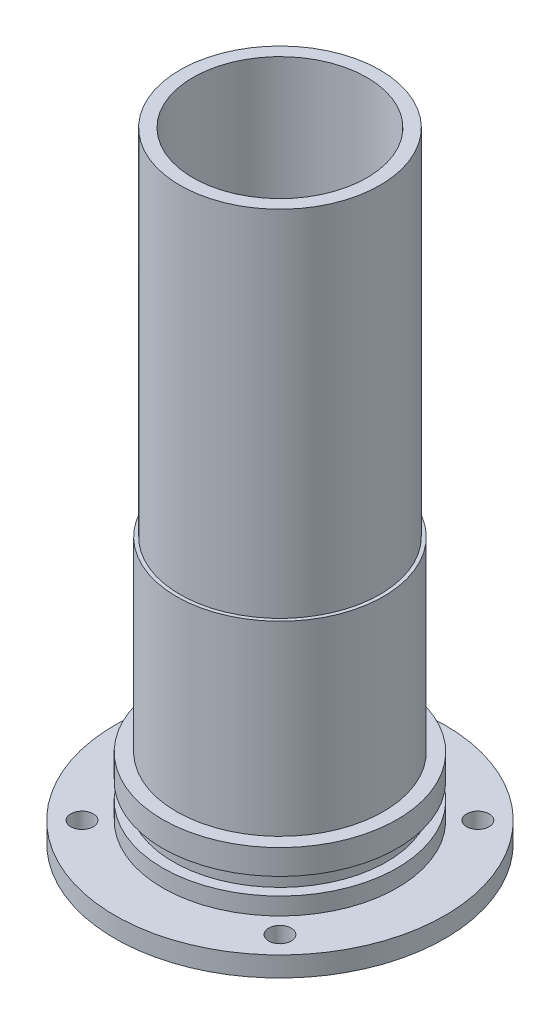
ISO-10303-21;
HEADER;
FILE_DESCRIPTION(('STEP AP214'),'2;1');
FILE_NAME('part.step','',(''),(''),'','','');
FILE_SCHEMA(('AUTOMOTIVE_DESIGN { 1 0 10303 214 1 1 1 1 }'));
ENDSEC;
DATA;
#1=APPLICATION_CONTEXT('core data for automotive mechanical design processes');
#2=APPLICATION_PROTOCOL_DEFINITION('international standard','automotive_design',2000,#1);
#3=PRODUCT_CONTEXT('',#1,'mechanical');
#4=PRODUCT('Part','Part','',(#3));
#5=PRODUCT_RELATED_PRODUCT_CATEGORY('part','',(#4));
#6=PRODUCT_DEFINITION_FORMATION('','',#4);
#7=PRODUCT_DEFINITION_CONTEXT('part definition',#1,'design');
#8=PRODUCT_DEFINITION('design','',#6,#7);
#9=PRODUCT_DEFINITION_SHAPE('','',#8);
#10=(LENGTH_UNIT() NAMED_UNIT(*) SI_UNIT(.MILLI.,.METRE.));
#11=(NAMED_UNIT(*) PLANE_ANGLE_UNIT() SI_UNIT($,.RADIAN.));
#12=(NAMED_UNIT(*) SI_UNIT($,.STERADIAN.) SOLID_ANGLE_UNIT());
#13=UNCERTAINTY_MEASURE_WITH_UNIT(LENGTH_MEASURE(1.E-05),#10,'distance_accuracy_value','');
#14=(GEOMETRIC_REPRESENTATION_CONTEXT(3) GLOBAL_UNCERTAINTY_ASSIGNED_CONTEXT((#13)) GLOBAL_UNIT_ASSIGNED_CONTEXT((#10,
#11,#12)) REPRESENTATION_CONTEXT('',''));
#15=CARTESIAN_POINT('',(0.,0.,0.));
#16=DIRECTION('',(0.,0.,1.));
#17=DIRECTION('',(1.,0.,0.));
#18=AXIS2_PLACEMENT_3D('',#15,#16,#17);
#19=CARTESIAN_POINT('',(33.,0.,0.));
#20=DIRECTION('',(0.,-1.,0.));
#21=DIRECTION('',(0.,0.,-1.));
#22=AXIS2_PLACEMENT_3D('',#19,#20,#21);
#23=PLANE('',#22);
#24=CARTESIAN_POINT('',(-19.7989898732233,0.,-19.7989898732233));
#25=DIRECTION('',(0.,-1.,0.));
#26=DIRECTION('',(0.,0.,-1.));
#27=AXIS2_PLACEMENT_3D('',#24,#25,#26);
#28=CIRCLE('',#27,2.25);
#29=CARTESIAN_POINT('',(-19.7989898732233,0.,-22.0489898732233));
#30=VERTEX_POINT('',#29);
#31=EDGE_CURVE('E90',#30,#30,#28,.T.);
#32=ORIENTED_EDGE('',*,*,#31,.F.);
#33=EDGE_LOOP('',(#32));
#34=FACE_BOUND('',#33,.T.);
#35=CARTESIAN_POINT('',(19.7989898732233,0.,-19.7989898732233));
#36=DIRECTION('',(0.,-1.,0.));
#37=DIRECTION('',(0.,0.,-1.));
#38=AXIS2_PLACEMENT_3D('',#35,#36,#37);
#39=CIRCLE('',#38,2.25);
#40=CARTESIAN_POINT('',(19.7989898732233,0.,-22.0489898732233));
#41=VERTEX_POINT('',#40);
#42=EDGE_CURVE('E96',#41,#41,#39,.T.);
#43=ORIENTED_EDGE('',*,*,#42,.F.);
#44=EDGE_LOOP('',(#43));
#45=FACE_BOUND('',#44,.T.);
#46=CARTESIAN_POINT('',(19.7989898732233,0.,19.7989898732233));
#47=DIRECTION('',(0.,-1.,0.));
#48=DIRECTION('',(0.,0.,-1.));
#49=AXIS2_PLACEMENT_3D('',#46,#47,#48);
#50=CIRCLE('',#49,2.25);
#51=CARTESIAN_POINT('',(19.7989898732233,0.,17.5489898732233));
#52=VERTEX_POINT('',#51);
#53=EDGE_CURVE('E84',#52,#52,#50,.T.);
#54=ORIENTED_EDGE('',*,*,#53,.F.);
#55=EDGE_LOOP('',(#54));
#56=FACE_BOUND('',#55,.T.);
#57=CARTESIAN_POINT('',(-19.7989898732233,0.,19.7989898732233));
#58=DIRECTION('',(0.,-1.,0.));
#59=DIRECTION('',(0.,0.,-1.));
#60=AXIS2_PLACEMENT_3D('',#57,#58,#59);
#61=CIRCLE('',#60,2.25);
#62=CARTESIAN_POINT('',(-19.7989898732233,0.,17.5489898732233));
#63=VERTEX_POINT('',#62);
#64=EDGE_CURVE('E80',#63,#63,#61,.T.);
#65=ORIENTED_EDGE('',*,*,#64,.F.);
#66=EDGE_LOOP('',(#65));
#67=FACE_BOUND('',#66,.T.);
#68=CARTESIAN_POINT('',(0.,0.,0.));
#69=DIRECTION('',(0.,-1.,0.));
#70=DIRECTION('',(0.,0.,-1.));
#71=AXIS2_PLACEMENT_3D('',#68,#69,#70);
#72=CIRCLE('',#71,33.);
#73=CARTESIAN_POINT('',(0.,0.,-33.));
#74=VERTEX_POINT('',#73);
#75=EDGE_CURVE('E77',#74,#74,#72,.T.);
#76=ORIENTED_EDGE('',*,*,#75,.T.);
#77=EDGE_LOOP('',(#76));
#78=FACE_BOUND('',#77,.T.);
#79=CARTESIAN_POINT('',(0.,0.,0.));
#80=DIRECTION('',(0.,-1.,0.));
#81=DIRECTION('',(0.,0.,-1.));
#82=AXIS2_PLACEMENT_3D('',#79,#80,#81);
#83=CIRCLE('',#82,17.4);
#84=CARTESIAN_POINT('',(0.,0.,-17.4));
#85=VERTEX_POINT('',#84);
#86=EDGE_CURVE('E10',#85,#85,#83,.T.);
#87=ORIENTED_EDGE('',*,*,#86,.F.);
#88=EDGE_LOOP('',(#87));
#89=FACE_BOUND('',#88,.T.);
#90=ADVANCED_FACE('F31',(#34,#45,#56,#67,#78,#89),#23,.T.);
#91=CARTESIAN_POINT('',(0.,0.,0.));
#92=DIRECTION('',(0.,-1.,0.));
#93=DIRECTION('',(0.,0.,-1.));
#94=AXIS2_PLACEMENT_3D('',#91,#92,#93);
#95=CYLINDRICAL_SURFACE('',#94,17.4);
#96=ORIENTED_EDGE('',*,*,#86,.T.);
#97=EDGE_LOOP('',(#96));
#98=FACE_BOUND('',#97,.T.);
#99=CARTESIAN_POINT('',(0.,124.,0.));
#100=DIRECTION('',(0.,-1.,0.));
#101=DIRECTION('',(0.,0.,-1.));
#102=AXIS2_PLACEMENT_3D('',#99,#100,#101);
#103=CIRCLE('',#102,17.4);
#104=CARTESIAN_POINT('',(0.,124.,-17.4));
#105=VERTEX_POINT('',#104);
#106=EDGE_CURVE('E37',#105,#105,#103,.T.);
#107=ORIENTED_EDGE('',*,*,#106,.F.);
#108=EDGE_LOOP('',(#107));
#109=FACE_BOUND('',#108,.T.);
#110=ADVANCED_FACE('F109',(#98,#109),#95,.F.);
#111=CARTESIAN_POINT('',(17.4,124.,0.));
#112=DIRECTION('',(0.,1.,0.));
#113=DIRECTION('',(0.,0.,1.));
#114=AXIS2_PLACEMENT_3D('',#111,#112,#113);
#115=PLANE('',#114);
#116=ORIENTED_EDGE('',*,*,#106,.T.);
#117=EDGE_LOOP('',(#116));
#118=FACE_BOUND('',#117,.T.);
#119=CARTESIAN_POINT('',(0.,124.,0.));
#120=DIRECTION('',(0.,-1.,0.));
#121=DIRECTION('',(0.,0.,-1.));
#122=AXIS2_PLACEMENT_3D('',#119,#120,#121);
#123=CIRCLE('',#122,20.);
#124=CARTESIAN_POINT('',(0.,124.,-20.));
#125=VERTEX_POINT('',#124);
#126=EDGE_CURVE('E41',#125,#125,#123,.T.);
#127=ORIENTED_EDGE('',*,*,#126,.F.);
#128=EDGE_LOOP('',(#127));
#129=FACE_BOUND('',#128,.T.);
#130=ADVANCED_FACE('F167',(#118,#129),#115,.T.);
#131=CARTESIAN_POINT('',(0.,0.,0.));
#132=DIRECTION('',(0.,-1.,0.));
#133=DIRECTION('',(0.,0.,-1.));
#134=AXIS2_PLACEMENT_3D('',#131,#132,#133);
#135=CYLINDRICAL_SURFACE('',#134,20.);
#136=ORIENTED_EDGE('',*,*,#126,.T.);
#137=EDGE_LOOP('',(#136));
#138=FACE_BOUND('',#137,.T.);
#139=CARTESIAN_POINT('',(0.,53.1124602600868,0.));
#140=DIRECTION('',(0.,-1.,0.));
#141=DIRECTION('',(0.,0.,-1.));
#142=AXIS2_PLACEMENT_3D('',#139,#140,#141);
#143=CIRCLE('',#142,20.);
#144=CARTESIAN_POINT('',(0.,53.1124602600868,-20.));
#145=VERTEX_POINT('',#144);
#146=EDGE_CURVE('E45',#145,#145,#143,.T.);
#147=ORIENTED_EDGE('',*,*,#146,.F.);
#148=EDGE_LOOP('',(#147));
#149=FACE_BOUND('',#148,.T.);
#150=ADVANCED_FACE('F163',(#138,#149),#135,.T.);
#151=CARTESIAN_POINT('',(20.7,53.1124602600868,0.));
#152=DIRECTION('',(0.,1.,0.));
#153=DIRECTION('',(0.,0.,1.));
#154=AXIS2_PLACEMENT_3D('',#151,#152,#153);
#155=PLANE('',#154);
#156=ORIENTED_EDGE('',*,*,#146,.T.);
#157=EDGE_LOOP('',(#156));
#158=FACE_BOUND('',#157,.T.);
#159=CARTESIAN_POINT('',(0.,53.1124602600868,0.));
#160=DIRECTION('',(0.,-1.,0.));
#161=DIRECTION('',(0.,0.,-1.));
#162=AXIS2_PLACEMENT_3D('',#159,#160,#161);
#163=CIRCLE('',#162,20.7);
#164=CARTESIAN_POINT('',(0.,53.1124602600868,-20.7));
#165=VERTEX_POINT('',#164);
#166=EDGE_CURVE('E50',#165,#165,#163,.T.);
#167=ORIENTED_EDGE('',*,*,#166,.F.);
#168=EDGE_LOOP('',(#167));
#169=FACE_BOUND('',#168,.T.);
#170=ADVANCED_FACE('F159',(#158,#169),#155,.T.);
#171=CARTESIAN_POINT('',(0.,0.,0.));
#172=DIRECTION('',(0.,-1.,0.));
#173=DIRECTION('',(0.,0.,-1.));
#174=AXIS2_PLACEMENT_3D('',#171,#172,#173);
#175=CYLINDRICAL_SURFACE('',#174,20.7);
#176=ORIENTED_EDGE('',*,*,#166,.T.);
#177=EDGE_LOOP('',(#176));
#178=FACE_BOUND('',#177,.T.);
#179=CARTESIAN_POINT('',(0.,15.85,0.));
#180=DIRECTION('',(0.,-1.,0.));
#181=DIRECTION('',(0.,0.,-1.));
#182=AXIS2_PLACEMENT_3D('',#179,#180,#181);
#183=CIRCLE('',#182,20.7);
#184=CARTESIAN_POINT('',(0.,15.85,-20.7));
#185=VERTEX_POINT('',#184);
#186=EDGE_CURVE('E53',#185,#185,#183,.T.);
#187=ORIENTED_EDGE('',*,*,#186,.F.);
#188=EDGE_LOOP('',(#187));
#189=FACE_BOUND('',#188,.T.);
#190=ADVANCED_FACE('F155',(#178,#189),#175,.T.);
#191=CARTESIAN_POINT('',(23.45,15.85,0.));
#192=DIRECTION('',(0.,1.,0.));
#193=DIRECTION('',(0.,0.,1.));
#194=AXIS2_PLACEMENT_3D('',#191,#192,#193);
#195=PLANE('',#194);
#196=ORIENTED_EDGE('',*,*,#186,.T.);
#197=EDGE_LOOP('',(#196));
#198=FACE_BOUND('',#197,.T.);
#199=CARTESIAN_POINT('',(0.,15.85,0.));
#200=DIRECTION('',(0.,-1.,0.));
#201=DIRECTION('',(0.,0.,-1.));
#202=AXIS2_PLACEMENT_3D('',#199,#200,#201);
#203=CIRCLE('',#202,23.45);
#204=CARTESIAN_POINT('',(0.,15.85,-23.45));
#205=VERTEX_POINT('',#204);
#206=EDGE_CURVE('E56',#205,#205,#203,.T.);
#207=ORIENTED_EDGE('',*,*,#206,.F.);
#208=EDGE_LOOP('',(#207));
#209=FACE_BOUND('',#208,.T.);
#210=ADVANCED_FACE('F151',(#198,#209),#195,.T.);
#211=CARTESIAN_POINT('',(0.,0.,0.));
#212=DIRECTION('',(0.,-1.,0.));
#213=DIRECTION('',(0.,0.,-1.));
#214=AXIS2_PLACEMENT_3D('',#211,#212,#213);
#215=CYLINDRICAL_SURFACE('',#214,23.45);
#216=ORIENTED_EDGE('',*,*,#206,.T.);
#217=EDGE_LOOP('',(#216));
#218=FACE_BOUND('',#217,.T.);
#219=CARTESIAN_POINT('',(0.,10.85,0.));
#220=DIRECTION('',(0.,-1.,0.));
#221=DIRECTION('',(0.,0.,-1.));
#222=AXIS2_PLACEMENT_3D('',#219,#220,#221);
#223=CIRCLE('',#222,23.45);
#224=CARTESIAN_POINT('',(0.,10.85,-23.45));
#225=VERTEX_POINT('',#224);
#226=EDGE_CURVE('E59',#225,#225,#223,.T.);
#227=ORIENTED_EDGE('',*,*,#226,.F.);
#228=EDGE_LOOP('',(#227));
#229=FACE_BOUND('',#228,.T.);
#230=ADVANCED_FACE('F147',(#218,#229),#215,.T.);
#231=CARTESIAN_POINT('',(21.3325630800075,10.85,0.));
#232=DIRECTION('',(0.,-1.,0.));
#233=DIRECTION('',(0.,0.,-1.));
#234=AXIS2_PLACEMENT_3D('',#231,#232,#233);
#235=PLANE('',#234);
#236=ORIENTED_EDGE('',*,*,#226,.T.);
#237=EDGE_LOOP('',(#236));
#238=FACE_BOUND('',#237,.T.);
#239=CARTESIAN_POINT('',(0.,10.85,0.));
#240=DIRECTION('',(0.,-1.,0.));
#241=DIRECTION('',(0.,0.,-1.));
#242=AXIS2_PLACEMENT_3D('',#239,#240,#241);
#243=CIRCLE('',#242,21.3325630800075);
#244=CARTESIAN_POINT('',(0.,10.85,-21.3325630800075));
#245=VERTEX_POINT('',#244);
#246=EDGE_CURVE('E62',#245,#245,#243,.T.);
#247=ORIENTED_EDGE('',*,*,#246,.F.);
#248=EDGE_LOOP('',(#247));
#249=FACE_BOUND('',#248,.T.);
#250=ADVANCED_FACE('F143',(#238,#249),#235,.T.);
#251=CARTESIAN_POINT('',(0.,0.,0.));
#252=DIRECTION('',(0.,-1.,0.));
#253=DIRECTION('',(0.,0.,-1.));
#254=AXIS2_PLACEMENT_3D('',#251,#252,#253);
#255=CYLINDRICAL_SURFACE('',#254,21.3325630800075);
#256=ORIENTED_EDGE('',*,*,#246,.T.);
#257=EDGE_LOOP('',(#256));
#258=FACE_BOUND('',#257,.T.);
#259=CARTESIAN_POINT('',(0.,7.45,0.));
#260=DIRECTION('',(0.,-1.,0.));
#261=DIRECTION('',(0.,0.,-1.));
#262=AXIS2_PLACEMENT_3D('',#259,#260,#261);
#263=CIRCLE('',#262,21.3325630800075);
#264=CARTESIAN_POINT('',(0.,7.45,-21.3325630800075));
#265=VERTEX_POINT('',#264);
#266=EDGE_CURVE('E65',#265,#265,#263,.T.);
#267=ORIENTED_EDGE('',*,*,#266,.F.);
#268=EDGE_LOOP('',(#267));
#269=FACE_BOUND('',#268,.T.);
#270=ADVANCED_FACE('F139',(#258,#269),#255,.T.);
#271=CARTESIAN_POINT('',(23.45,7.45,0.));
#272=DIRECTION('',(0.,1.,0.));
#273=DIRECTION('',(0.,0.,1.));
#274=AXIS2_PLACEMENT_3D('',#271,#272,#273);
#275=PLANE('',#274);
#276=ORIENTED_EDGE('',*,*,#266,.T.);
#277=EDGE_LOOP('',(#276));
#278=FACE_BOUND('',#277,.T.);
#279=CARTESIAN_POINT('',(0.,7.45,0.));
#280=DIRECTION('',(0.,-1.,0.));
#281=DIRECTION('',(0.,0.,-1.));
#282=AXIS2_PLACEMENT_3D('',#279,#280,#281);
#283=CIRCLE('',#282,23.45);
#284=CARTESIAN_POINT('',(0.,7.45,-23.45));
#285=VERTEX_POINT('',#284);
#286=EDGE_CURVE('E68',#285,#285,#283,.T.);
#287=ORIENTED_EDGE('',*,*,#286,.F.);
#288=EDGE_LOOP('',(#287));
#289=FACE_BOUND('',#288,.T.);
#290=ADVANCED_FACE('F135',(#278,#289),#275,.T.);
#291=CARTESIAN_POINT('',(0.,0.,0.));
#292=DIRECTION('',(0.,-1.,0.));
#293=DIRECTION('',(0.,0.,-1.));
#294=AXIS2_PLACEMENT_3D('',#291,#292,#293);
#295=CYLINDRICAL_SURFACE('',#294,23.45);
#296=ORIENTED_EDGE('',*,*,#286,.T.);
#297=EDGE_LOOP('',(#296));
#298=FACE_BOUND('',#297,.T.);
#299=CARTESIAN_POINT('',(0.,4.,0.));
#300=DIRECTION('',(0.,-1.,0.));
#301=DIRECTION('',(0.,0.,-1.));
#302=AXIS2_PLACEMENT_3D('',#299,#300,#301);
#303=CIRCLE('',#302,23.45);
#304=CARTESIAN_POINT('',(0.,4.,-23.45));
#305=VERTEX_POINT('',#304);
#306=EDGE_CURVE('E71',#305,#305,#303,.T.);
#307=ORIENTED_EDGE('',*,*,#306,.F.);
#308=EDGE_LOOP('',(#307));
#309=FACE_BOUND('',#308,.T.);
#310=ADVANCED_FACE('F128',(#298,#309),#295,.T.);
#311=CARTESIAN_POINT('',(23.45,4.,0.));
#312=DIRECTION('',(0.,1.,0.));
#313=DIRECTION('',(0.,0.,1.));
#314=AXIS2_PLACEMENT_3D('',#311,#312,#313);
#315=PLANE('',#314);
#316=CARTESIAN_POINT('',(-19.7989898732233,4.,-19.7989898732233));
#317=DIRECTION('',(0.,1.,0.));
#318=DIRECTION('',(0.,0.,1.));
#319=AXIS2_PLACEMENT_3D('',#316,#317,#318);
#320=CIRCLE('',#319,2.25);
#321=CARTESIAN_POINT('',(-19.7989898732233,3.99999999999999,-22.0489898732233));
#322=VERTEX_POINT('',#321);
#323=EDGE_CURVE('E87',#322,#322,#320,.F.);
#324=ORIENTED_EDGE('',*,*,#323,.T.);
#325=EDGE_LOOP('',(#324));
#326=FACE_BOUND('',#325,.T.);
#327=CARTESIAN_POINT('',(19.7989898732233,4.,-19.7989898732233));
#328=DIRECTION('',(0.,1.,0.));
#329=DIRECTION('',(0.,0.,1.));
#330=AXIS2_PLACEMENT_3D('',#327,#328,#329);
#331=CIRCLE('',#330,2.25);
#332=CARTESIAN_POINT('',(19.7989898732233,3.99999999999999,-22.0489898732233));
#333=VERTEX_POINT('',#332);
#334=EDGE_CURVE('E93',#333,#333,#331,.F.);
#335=ORIENTED_EDGE('',*,*,#334,.T.);
#336=EDGE_LOOP('',(#335));
#337=FACE_BOUND('',#336,.T.);
#338=CARTESIAN_POINT('',(19.7989898732233,4.,19.7989898732233));
#339=DIRECTION('',(0.,1.,0.));
#340=DIRECTION('',(0.,0.,1.));
#341=AXIS2_PLACEMENT_3D('',#338,#339,#340);
#342=CIRCLE('',#341,2.25);
#343=CARTESIAN_POINT('',(19.7989898732233,3.99999999999999,17.5489898732233));
#344=VERTEX_POINT('',#343);
#345=EDGE_CURVE('E99',#344,#344,#342,.F.);
#346=ORIENTED_EDGE('',*,*,#345,.T.);
#347=EDGE_LOOP('',(#346));
#348=FACE_BOUND('',#347,.T.);
#349=CARTESIAN_POINT('',(-19.7989898732233,4.,19.7989898732233));
#350=DIRECTION('',(0.,1.,0.));
#351=DIRECTION('',(0.,0.,1.));
#352=AXIS2_PLACEMENT_3D('',#349,#350,#351);
#353=CIRCLE('',#352,2.25);
#354=CARTESIAN_POINT('',(-19.7989898732233,3.99999999999999,17.5489898732233));
#355=VERTEX_POINT('',#354);
#356=EDGE_CURVE('E81',#355,#355,#353,.F.);
#357=ORIENTED_EDGE('',*,*,#356,.T.);
#358=EDGE_LOOP('',(#357));
#359=FACE_BOUND('',#358,.T.);
#360=ORIENTED_EDGE('',*,*,#306,.T.);
#361=EDGE_LOOP('',(#360));
#362=FACE_BOUND('',#361,.T.);
#363=CARTESIAN_POINT('',(0.,4.,0.));
#364=DIRECTION('',(0.,-1.,0.));
#365=DIRECTION('',(0.,0.,-1.));
#366=AXIS2_PLACEMENT_3D('',#363,#364,#365);
#367=CIRCLE('',#366,33.);
#368=CARTESIAN_POINT('',(0.,4.,-33.));
#369=VERTEX_POINT('',#368);
#370=EDGE_CURVE('E74',#369,#369,#367,.T.);
#371=ORIENTED_EDGE('',*,*,#370,.F.);
#372=EDGE_LOOP('',(#371));
#373=FACE_BOUND('',#372,.T.);
#374=ADVANCED_FACE('F119',(#326,#337,#348,#359,#362,#373),#315,.T.);
#375=CARTESIAN_POINT('',(0.,0.,0.));
#376=DIRECTION('',(0.,-1.,0.));
#377=DIRECTION('',(0.,0.,-1.));
#378=AXIS2_PLACEMENT_3D('',#375,#376,#377);
#379=CYLINDRICAL_SURFACE('',#378,33.);
#380=ORIENTED_EDGE('',*,*,#370,.T.);
#381=EDGE_LOOP('',(#380));
#382=FACE_BOUND('',#381,.T.);
#383=ORIENTED_EDGE('',*,*,#75,.F.);
#384=EDGE_LOOP('',(#383));
#385=FACE_BOUND('',#384,.T.);
#386=ADVANCED_FACE('F116',(#382,#385),#379,.T.);
#387=CARTESIAN_POINT('',(-19.7989898732233,124.001,19.7989898732233));
#388=DIRECTION('',(0.,-1.,0.));
#389=DIRECTION('',(0.,0.,-1.));
#390=AXIS2_PLACEMENT_3D('',#387,#388,#389);
#391=CYLINDRICAL_SURFACE('',#390,2.25);
#392=CARTESIAN_POINT('',(-19.7989898732233,3.99999999999999,17.5489898732233));
#393=CARTESIAN_POINT('',(-19.7989898732233,3.95833333333332,17.5489898732233));
#394=CARTESIAN_POINT('',(-19.7989898732233,3.91666666666666,17.5489898732233));
#395=CARTESIAN_POINT('',(-19.7989898732233,3.83333333333332,17.5489898732233));
#396=CARTESIAN_POINT('',(-19.7989898732233,3.79166666666666,17.5489898732233));
#397=CARTESIAN_POINT('',(-19.7989898732233,3.70833333333332,17.5489898732233));
#398=CARTESIAN_POINT('',(-19.7989898732233,3.66666666666666,17.5489898732233));
#399=CARTESIAN_POINT('',(-19.7989898732233,3.58333333333332,17.5489898732233));
#400=CARTESIAN_POINT('',(-19.7989898732233,3.54166666666666,17.5489898732233));
#401=CARTESIAN_POINT('',(-19.7989898732233,3.45833333333332,17.5489898732233));
#402=CARTESIAN_POINT('',(-19.7989898732233,3.41666666666666,17.5489898732233));
#403=CARTESIAN_POINT('',(-19.7989898732233,3.33333333333332,17.5489898732233));
#404=CARTESIAN_POINT('',(-19.7989898732233,3.29166666666666,17.5489898732233));
#405=CARTESIAN_POINT('',(-19.7989898732233,3.20833333333332,17.5489898732233));
#406=CARTESIAN_POINT('',(-19.7989898732233,3.16666666666666,17.5489898732233));
#407=CARTESIAN_POINT('',(-19.7989898732233,3.08333333333332,17.5489898732233));
#408=CARTESIAN_POINT('',(-19.7989898732233,3.04166666666666,17.5489898732233));
#409=CARTESIAN_POINT('',(-19.7989898732233,2.95833333333333,17.5489898732233));
#410=CARTESIAN_POINT('',(-19.7989898732233,2.91666666666666,17.5489898732233));
#411=CARTESIAN_POINT('',(-19.7989898732233,2.83333333333334,17.5489898732233));
#412=CARTESIAN_POINT('',(-19.7989898732233,2.79166666666667,17.5489898732233));
#413=CARTESIAN_POINT('',(-19.7989898732233,2.70833333333334,17.5489898732233));
#414=CARTESIAN_POINT('',(-19.7989898732233,2.66666666666667,17.5489898732233));
#415=CARTESIAN_POINT('',(-19.7989898732233,2.58333333333334,17.5489898732233));
#416=CARTESIAN_POINT('',(-19.7989898732233,2.54166666666667,17.5489898732233));
#417=CARTESIAN_POINT('',(-19.7989898732233,2.45833333333334,17.5489898732233));
#418=CARTESIAN_POINT('',(-19.7989898732233,2.41666666666667,17.5489898732233));
#419=CARTESIAN_POINT('',(-19.7989898732233,2.33333333333334,17.5489898732233));
#420=CARTESIAN_POINT('',(-19.7989898732233,2.29166666666667,17.5489898732233));
#421=CARTESIAN_POINT('',(-19.7989898732233,2.20833333333334,17.5489898732233));
#422=CARTESIAN_POINT('',(-19.7989898732233,2.16666666666667,17.5489898732233));
#423=CARTESIAN_POINT('',(-19.7989898732233,2.08333333333334,17.5489898732233));
#424=CARTESIAN_POINT('',(-19.7989898732233,2.04166666666667,17.5489898732233));
#425=CARTESIAN_POINT('',(-19.7989898732233,1.95833333333334,17.5489898732233));
#426=CARTESIAN_POINT('',(-19.7989898732233,1.91666666666667,17.5489898732233));
#427=CARTESIAN_POINT('',(-19.7989898732233,1.83333333333334,17.5489898732233));
#428=CARTESIAN_POINT('',(-19.7989898732233,1.79166666666667,17.5489898732233));
#429=CARTESIAN_POINT('',(-19.7989898732233,1.70833333333333,17.5489898732233));
#430=CARTESIAN_POINT('',(-19.7989898732233,1.66666666666667,17.5489898732233));
#431=CARTESIAN_POINT('',(-19.7989898732233,1.58333333333333,17.5489898732233));
#432=CARTESIAN_POINT('',(-19.7989898732233,1.54166666666667,17.5489898732233));
#433=CARTESIAN_POINT('',(-19.7989898732233,1.45833333333333,17.5489898732233));
#434=CARTESIAN_POINT('',(-19.7989898732233,1.41666666666667,17.5489898732233));
#435=CARTESIAN_POINT('',(-19.7989898732233,1.33333333333333,17.5489898732233));
#436=CARTESIAN_POINT('',(-19.7989898732233,1.29166666666667,17.5489898732233));
#437=CARTESIAN_POINT('',(-19.7989898732233,1.20833333333333,17.5489898732233));
#438=CARTESIAN_POINT('',(-19.7989898732233,1.16666666666667,17.5489898732233));
#439=CARTESIAN_POINT('',(-19.7989898732233,1.08333333333334,17.5489898732233));
#440=CARTESIAN_POINT('',(-19.7989898732233,1.04166666666668,17.5489898732233));
#441=CARTESIAN_POINT('',(-19.7989898732233,0.958333333333348,17.5489898732233));
#442=CARTESIAN_POINT('',(-19.7989898732233,0.916666666666681,17.5489898732233));
#443=CARTESIAN_POINT('',(-19.7989898732233,0.833333333333348,17.5489898732233));
#444=CARTESIAN_POINT('',(-19.7989898732233,0.791666666666681,17.5489898732233));
#445=CARTESIAN_POINT('',(-19.7989898732233,0.708333333333348,17.5489898732233));
#446=CARTESIAN_POINT('',(-19.7989898732233,0.666666666666681,17.5489898732233));
#447=CARTESIAN_POINT('',(-19.7989898732233,0.583333333333348,17.5489898732233));
#448=CARTESIAN_POINT('',(-19.7989898732233,0.541666666666681,17.5489898732233));
#449=CARTESIAN_POINT('',(-19.7989898732233,0.458333333333348,17.5489898732233));
#450=CARTESIAN_POINT('',(-19.7989898732233,0.416666666666681,17.5489898732233));
#451=CARTESIAN_POINT('',(-19.7989898732233,0.333333333333348,17.5489898732233));
#452=CARTESIAN_POINT('',(-19.7989898732233,0.291666666666681,17.5489898732233));
#453=CARTESIAN_POINT('',(-19.7989898732233,0.208333333333347,17.5489898732233));
#454=CARTESIAN_POINT('',(-19.7989898732233,0.166666666666681,17.5489898732233));
#455=CARTESIAN_POINT('',(-19.7989898732233,0.0833333333333473,17.5489898732233));
#456=CARTESIAN_POINT('',(-19.7989898732233,0.0416666666666805,17.5489898732233));
#457=CARTESIAN_POINT('',(-19.7989898732233,0.,17.5489898732233));
#458=B_SPLINE_CURVE_WITH_KNOTS('',3,(#392,#393,#394,#395,#396,#397,#398,#399,#400,#401,#402,
#403,#404,#405,#406,#407,#408,#409,#410,#411,#412,#413,#414,#415,#416,#417,#418,#419,#420,#421,
#422,#423,#424,#425,#426,#427,#428,#429,#430,#431,#432,#433,#434,#435,#436,#437,#438,#439,#440,
#441,#442,#443,#444,#445,#446,#447,#448,#449,#450,#451,#452,#453,#454,#455,#456,#457),
.UNSPECIFIED.,.F.,.F.,(4,2,2,2,2,2,2,2,2,2,2,2,2,2,2,2,2,2,2,2,2,2,2,2,2,2,2,2,2,2,2,2,4),(0.,
0.125,0.25,0.375,0.5,0.625000000000001,0.750000000000001,0.875000000000001,1.,1.12499999999999,
1.24999999999999,1.37499999999999,1.49999999999999,1.62499999999999,1.74999999999999,
1.87499999999999,1.99999999999999,2.12499999999999,2.24999999999999,2.37499999999999,
2.49999999999999,2.62499999999999,2.74999999999999,2.87499999999999,2.99999999999998,
3.12499999999998,3.24999999999998,3.37499999999998,3.49999999999998,3.62499999999998,
3.74999999999998,3.87499999999998,3.99999999999998),.UNSPECIFIED.);
#459=EDGE_CURVE('BSEAM118',#355,#63,#458,.T.);
#460=ORIENTED_EDGE('',*,*,#356,.F.);
#461=ORIENTED_EDGE('',*,*,#64,.T.);
#462=ORIENTED_EDGE('',*,*,#459,.T.);
#463=ORIENTED_EDGE('',*,*,#459,.F.);
#464=EDGE_LOOP('',(#460,#462,#461,#463));
#465=FACE_BOUND('',#464,.T.);
#466=ADVANCED_FACE('F118',(#465),#391,.F.);
#467=CARTESIAN_POINT('',(19.7989898732233,124.001,19.7989898732233));
#468=DIRECTION('',(0.,-1.,0.));
#469=DIRECTION('',(0.,0.,-1.));
#470=AXIS2_PLACEMENT_3D('',#467,#468,#469);
#471=CYLINDRICAL_SURFACE('',#470,2.25);
#472=CARTESIAN_POINT('',(19.7989898732233,3.99999999999999,17.5489898732233));
#473=CARTESIAN_POINT('',(19.7989898732233,3.95833333333332,17.5489898732233));
#474=CARTESIAN_POINT('',(19.7989898732233,3.91666666666666,17.5489898732233));
#475=CARTESIAN_POINT('',(19.7989898732233,3.83333333333332,17.5489898732233));
#476=CARTESIAN_POINT('',(19.7989898732233,3.79166666666666,17.5489898732233));
#477=CARTESIAN_POINT('',(19.7989898732233,3.70833333333332,17.5489898732233));
#478=CARTESIAN_POINT('',(19.7989898732233,3.66666666666666,17.5489898732233));
#479=CARTESIAN_POINT('',(19.7989898732233,3.58333333333332,17.5489898732233));
#480=CARTESIAN_POINT('',(19.7989898732233,3.54166666666666,17.5489898732233));
#481=CARTESIAN_POINT('',(19.7989898732233,3.45833333333332,17.5489898732233));
#482=CARTESIAN_POINT('',(19.7989898732233,3.41666666666666,17.5489898732233));
#483=CARTESIAN_POINT('',(19.7989898732233,3.33333333333332,17.5489898732233));
#484=CARTESIAN_POINT('',(19.7989898732233,3.29166666666666,17.5489898732233));
#485=CARTESIAN_POINT('',(19.7989898732233,3.20833333333332,17.5489898732233));
#486=CARTESIAN_POINT('',(19.7989898732233,3.16666666666666,17.5489898732233));
#487=CARTESIAN_POINT('',(19.7989898732233,3.08333333333332,17.5489898732233));
#488=CARTESIAN_POINT('',(19.7989898732233,3.04166666666666,17.5489898732233));
#489=CARTESIAN_POINT('',(19.7989898732233,2.95833333333333,17.5489898732233));
#490=CARTESIAN_POINT('',(19.7989898732233,2.91666666666666,17.5489898732233));
#491=CARTESIAN_POINT('',(19.7989898732233,2.83333333333334,17.5489898732233));
#492=CARTESIAN_POINT('',(19.7989898732233,2.79166666666667,17.5489898732233));
#493=CARTESIAN_POINT('',(19.7989898732233,2.70833333333334,17.5489898732233));
#494=CARTESIAN_POINT('',(19.7989898732233,2.66666666666667,17.5489898732233));
#495=CARTESIAN_POINT('',(19.7989898732233,2.58333333333334,17.5489898732233));
#496=CARTESIAN_POINT('',(19.7989898732233,2.54166666666667,17.5489898732233));
#497=CARTESIAN_POINT('',(19.7989898732233,2.45833333333334,17.5489898732233));
#498=CARTESIAN_POINT('',(19.7989898732233,2.41666666666667,17.5489898732233));
#499=CARTESIAN_POINT('',(19.7989898732233,2.33333333333334,17.5489898732233));
#500=CARTESIAN_POINT('',(19.7989898732233,2.29166666666667,17.5489898732233));
#501=CARTESIAN_POINT('',(19.7989898732233,2.20833333333334,17.5489898732233));
#502=CARTESIAN_POINT('',(19.7989898732233,2.16666666666667,17.5489898732233));
#503=CARTESIAN_POINT('',(19.7989898732233,2.08333333333334,17.5489898732233));
#504=CARTESIAN_POINT('',(19.7989898732233,2.04166666666667,17.5489898732233));
#505=CARTESIAN_POINT('',(19.7989898732233,1.95833333333334,17.5489898732233));
#506=CARTESIAN_POINT('',(19.7989898732233,1.91666666666667,17.5489898732233));
#507=CARTESIAN_POINT('',(19.7989898732233,1.83333333333334,17.5489898732233));
#508=CARTESIAN_POINT('',(19.7989898732233,1.79166666666667,17.5489898732233));
#509=CARTESIAN_POINT('',(19.7989898732233,1.70833333333333,17.5489898732233));
#510=CARTESIAN_POINT('',(19.7989898732233,1.66666666666667,17.5489898732233));
#511=CARTESIAN_POINT('',(19.7989898732233,1.58333333333333,17.5489898732233));
#512=CARTESIAN_POINT('',(19.7989898732233,1.54166666666667,17.5489898732233));
#513=CARTESIAN_POINT('',(19.7989898732233,1.45833333333333,17.5489898732233));
#514=CARTESIAN_POINT('',(19.7989898732233,1.41666666666667,17.5489898732233));
#515=CARTESIAN_POINT('',(19.7989898732233,1.33333333333333,17.5489898732233));
#516=CARTESIAN_POINT('',(19.7989898732233,1.29166666666667,17.5489898732233));
#517=CARTESIAN_POINT('',(19.7989898732233,1.20833333333333,17.5489898732233));
#518=CARTESIAN_POINT('',(19.7989898732233,1.16666666666667,17.5489898732233));
#519=CARTESIAN_POINT('',(19.7989898732233,1.08333333333334,17.5489898732233));
#520=CARTESIAN_POINT('',(19.7989898732233,1.04166666666668,17.5489898732233));
#521=CARTESIAN_POINT('',(19.7989898732233,0.958333333333348,17.5489898732233));
#522=CARTESIAN_POINT('',(19.7989898732233,0.916666666666681,17.5489898732233));
#523=CARTESIAN_POINT('',(19.7989898732233,0.833333333333348,17.5489898732233));
#524=CARTESIAN_POINT('',(19.7989898732233,0.791666666666681,17.5489898732233));
#525=CARTESIAN_POINT('',(19.7989898732233,0.708333333333348,17.5489898732233));
#526=CARTESIAN_POINT('',(19.7989898732233,0.666666666666681,17.5489898732233));
#527=CARTESIAN_POINT('',(19.7989898732233,0.583333333333348,17.5489898732233));
#528=CARTESIAN_POINT('',(19.7989898732233,0.541666666666681,17.5489898732233));
#529=CARTESIAN_POINT('',(19.7989898732233,0.458333333333348,17.5489898732233));
#530=CARTESIAN_POINT('',(19.7989898732233,0.416666666666681,17.5489898732233));
#531=CARTESIAN_POINT('',(19.7989898732233,0.333333333333348,17.5489898732233));
#532=CARTESIAN_POINT('',(19.7989898732233,0.291666666666681,17.5489898732233));
#533=CARTESIAN_POINT('',(19.7989898732233,0.208333333333347,17.5489898732233));
#534=CARTESIAN_POINT('',(19.7989898732233,0.166666666666681,17.5489898732233));
#535=CARTESIAN_POINT('',(19.7989898732233,0.0833333333333473,17.5489898732233));
#536=CARTESIAN_POINT('',(19.7989898732233,0.0416666666666805,17.5489898732233));
#537=CARTESIAN_POINT('',(19.7989898732233,0.,17.5489898732233));
#538=B_SPLINE_CURVE_WITH_KNOTS('',3,(#472,#473,#474,#475,#476,#477,#478,#479,#480,#481,#482,
#483,#484,#485,#486,#487,#488,#489,#490,#491,#492,#493,#494,#495,#496,#497,#498,#499,#500,#501,
#502,#503,#504,#505,#506,#507,#508,#509,#510,#511,#512,#513,#514,#515,#516,#517,#518,#519,#520,
#521,#522,#523,#524,#525,#526,#527,#528,#529,#530,#531,#532,#533,#534,#535,#536,#537),
.UNSPECIFIED.,.F.,.F.,(4,2,2,2,2,2,2,2,2,2,2,2,2,2,2,2,2,2,2,2,2,2,2,2,2,2,2,2,2,2,2,2,4),(0.,
0.125,0.25,0.375,0.5,0.625000000000001,0.750000000000001,0.875000000000001,1.,1.12499999999999,
1.24999999999999,1.37499999999999,1.49999999999999,1.62499999999999,1.74999999999999,
1.87499999999999,1.99999999999999,2.12499999999999,2.24999999999999,2.37499999999999,
2.49999999999999,2.62499999999999,2.74999999999999,2.87499999999999,2.99999999999998,
3.12499999999998,3.24999999999998,3.37499999999998,3.49999999999998,3.62499999999998,
3.74999999999998,3.87499999999998,3.99999999999998),.UNSPECIFIED.);
#539=EDGE_CURVE('BSEAM105',#344,#52,#538,.T.);
#540=ORIENTED_EDGE('',*,*,#345,.F.);
#541=ORIENTED_EDGE('',*,*,#53,.T.);
#542=ORIENTED_EDGE('',*,*,#539,.T.);
#543=ORIENTED_EDGE('',*,*,#539,.F.);
#544=EDGE_LOOP('',(#540,#542,#541,#543));
#545=FACE_BOUND('',#544,.T.);
#546=ADVANCED_FACE('F105',(#545),#471,.F.);
#547=CARTESIAN_POINT('',(19.7989898732233,124.001,-19.7989898732233));
#548=DIRECTION('',(0.,-1.,0.));
#549=DIRECTION('',(0.,0.,-1.));
#550=AXIS2_PLACEMENT_3D('',#547,#548,#549);
#551=CYLINDRICAL_SURFACE('',#550,2.25);
#552=CARTESIAN_POINT('',(19.7989898732233,3.99999999999999,-22.0489898732233));
#553=CARTESIAN_POINT('',(19.7989898732233,3.95833333333332,-22.0489898732233));
#554=CARTESIAN_POINT('',(19.7989898732233,3.91666666666666,-22.0489898732233));
#555=CARTESIAN_POINT('',(19.7989898732233,3.83333333333332,-22.0489898732233));
#556=CARTESIAN_POINT('',(19.7989898732233,3.79166666666666,-22.0489898732233));
#557=CARTESIAN_POINT('',(19.7989898732233,3.70833333333332,-22.0489898732233));
#558=CARTESIAN_POINT('',(19.7989898732233,3.66666666666666,-22.0489898732233));
#559=CARTESIAN_POINT('',(19.7989898732233,3.58333333333332,-22.0489898732233));
#560=CARTESIAN_POINT('',(19.7989898732233,3.54166666666666,-22.0489898732233));
#561=CARTESIAN_POINT('',(19.7989898732233,3.45833333333332,-22.0489898732233));
#562=CARTESIAN_POINT('',(19.7989898732233,3.41666666666666,-22.0489898732233));
#563=CARTESIAN_POINT('',(19.7989898732233,3.33333333333332,-22.0489898732233));
#564=CARTESIAN_POINT('',(19.7989898732233,3.29166666666666,-22.0489898732233));
#565=CARTESIAN_POINT('',(19.7989898732233,3.20833333333332,-22.0489898732233));
#566=CARTESIAN_POINT('',(19.7989898732233,3.16666666666666,-22.0489898732233));
#567=CARTESIAN_POINT('',(19.7989898732233,3.08333333333332,-22.0489898732233));
#568=CARTESIAN_POINT('',(19.7989898732233,3.04166666666666,-22.0489898732233));
#569=CARTESIAN_POINT('',(19.7989898732233,2.95833333333333,-22.0489898732233));
#570=CARTESIAN_POINT('',(19.7989898732233,2.91666666666666,-22.0489898732233));
#571=CARTESIAN_POINT('',(19.7989898732233,2.83333333333334,-22.0489898732233));
#572=CARTESIAN_POINT('',(19.7989898732233,2.79166666666667,-22.0489898732233));
#573=CARTESIAN_POINT('',(19.7989898732233,2.70833333333334,-22.0489898732233));
#574=CARTESIAN_POINT('',(19.7989898732233,2.66666666666667,-22.0489898732233));
#575=CARTESIAN_POINT('',(19.7989898732233,2.58333333333334,-22.0489898732233));
#576=CARTESIAN_POINT('',(19.7989898732233,2.54166666666667,-22.0489898732233));
#577=CARTESIAN_POINT('',(19.7989898732233,2.45833333333334,-22.0489898732233));
#578=CARTESIAN_POINT('',(19.7989898732233,2.41666666666667,-22.0489898732233));
#579=CARTESIAN_POINT('',(19.7989898732233,2.33333333333334,-22.0489898732233));
#580=CARTESIAN_POINT('',(19.7989898732233,2.29166666666667,-22.0489898732233));
#581=CARTESIAN_POINT('',(19.7989898732233,2.20833333333334,-22.0489898732233));
#582=CARTESIAN_POINT('',(19.7989898732233,2.16666666666667,-22.0489898732233));
#583=CARTESIAN_POINT('',(19.7989898732233,2.08333333333334,-22.0489898732233));
#584=CARTESIAN_POINT('',(19.7989898732233,2.04166666666667,-22.0489898732233));
#585=CARTESIAN_POINT('',(19.7989898732233,1.95833333333334,-22.0489898732233));
#586=CARTESIAN_POINT('',(19.7989898732233,1.91666666666667,-22.0489898732233));
#587=CARTESIAN_POINT('',(19.7989898732233,1.83333333333334,-22.0489898732233));
#588=CARTESIAN_POINT('',(19.7989898732233,1.79166666666667,-22.0489898732233));
#589=CARTESIAN_POINT('',(19.7989898732233,1.70833333333333,-22.0489898732233));
#590=CARTESIAN_POINT('',(19.7989898732233,1.66666666666667,-22.0489898732233));
#591=CARTESIAN_POINT('',(19.7989898732233,1.58333333333333,-22.0489898732233));
#592=CARTESIAN_POINT('',(19.7989898732233,1.54166666666667,-22.0489898732233));
#593=CARTESIAN_POINT('',(19.7989898732233,1.45833333333333,-22.0489898732233));
#594=CARTESIAN_POINT('',(19.7989898732233,1.41666666666667,-22.0489898732233));
#595=CARTESIAN_POINT('',(19.7989898732233,1.33333333333333,-22.0489898732233));
#596=CARTESIAN_POINT('',(19.7989898732233,1.29166666666667,-22.0489898732233));
#597=CARTESIAN_POINT('',(19.7989898732233,1.20833333333333,-22.0489898732233));
#598=CARTESIAN_POINT('',(19.7989898732233,1.16666666666667,-22.0489898732233));
#599=CARTESIAN_POINT('',(19.7989898732233,1.08333333333334,-22.0489898732233));
#600=CARTESIAN_POINT('',(19.7989898732233,1.04166666666668,-22.0489898732233));
#601=CARTESIAN_POINT('',(19.7989898732233,0.958333333333348,-22.0489898732233));
#602=CARTESIAN_POINT('',(19.7989898732233,0.916666666666681,-22.0489898732233));
#603=CARTESIAN_POINT('',(19.7989898732233,0.833333333333348,-22.0489898732233));
#604=CARTESIAN_POINT('',(19.7989898732233,0.791666666666681,-22.0489898732233));
#605=CARTESIAN_POINT('',(19.7989898732233,0.708333333333348,-22.0489898732233));
#606=CARTESIAN_POINT('',(19.7989898732233,0.666666666666681,-22.0489898732233));
#607=CARTESIAN_POINT('',(19.7989898732233,0.583333333333348,-22.0489898732233));
#608=CARTESIAN_POINT('',(19.7989898732233,0.541666666666681,-22.0489898732233));
#609=CARTESIAN_POINT('',(19.7989898732233,0.458333333333348,-22.0489898732233));
#610=CARTESIAN_POINT('',(19.7989898732233,0.416666666666681,-22.0489898732233));
#611=CARTESIAN_POINT('',(19.7989898732233,0.333333333333348,-22.0489898732233));
#612=CARTESIAN_POINT('',(19.7989898732233,0.291666666666681,-22.0489898732233));
#613=CARTESIAN_POINT('',(19.7989898732233,0.208333333333347,-22.0489898732233));
#614=CARTESIAN_POINT('',(19.7989898732233,0.166666666666681,-22.0489898732233));
#615=CARTESIAN_POINT('',(19.7989898732233,0.0833333333333473,-22.0489898732233));
#616=CARTESIAN_POINT('',(19.7989898732233,0.0416666666666805,-22.0489898732233));
#617=CARTESIAN_POINT('',(19.7989898732233,0.,-22.0489898732233));
#618=B_SPLINE_CURVE_WITH_KNOTS('',3,(#552,#553,#554,#555,#556,#557,#558,#559,#560,#561,#562,
#563,#564,#565,#566,#567,#568,#569,#570,#571,#572,#573,#574,#575,#576,#577,#578,#579,#580,#581,
#582,#583,#584,#585,#586,#587,#588,#589,#590,#591,#592,#593,#594,#595,#596,#597,#598,#599,#600,
#601,#602,#603,#604,#605,#606,#607,#608,#609,#610,#611,#612,#613,#614,#615,#616,#617),
.UNSPECIFIED.,.F.,.F.,(4,2,2,2,2,2,2,2,2,2,2,2,2,2,2,2,2,2,2,2,2,2,2,2,2,2,2,2,2,2,2,2,4),(0.,
0.125,0.25,0.375,0.5,0.625000000000001,0.750000000000001,0.875000000000001,1.,1.12499999999999,
1.24999999999999,1.37499999999999,1.49999999999999,1.62499999999999,1.74999999999999,
1.87499999999999,1.99999999999999,2.12499999999999,2.24999999999999,2.37499999999999,
2.49999999999999,2.62499999999999,2.74999999999999,2.87499999999999,2.99999999999998,
3.12499999999998,3.24999999999998,3.37499999999998,3.49999999999998,3.62499999999998,
3.74999999999998,3.87499999999998,3.99999999999998),.UNSPECIFIED.);
#619=EDGE_CURVE('BSEAM238',#333,#41,#618,.T.);
#620=ORIENTED_EDGE('',*,*,#334,.F.);
#621=ORIENTED_EDGE('',*,*,#42,.T.);
#622=ORIENTED_EDGE('',*,*,#619,.T.);
#623=ORIENTED_EDGE('',*,*,#619,.F.);
#624=EDGE_LOOP('',(#620,#622,#621,#623));
#625=FACE_BOUND('',#624,.T.);
#626=ADVANCED_FACE('F238',(#625),#551,.F.);
#627=CARTESIAN_POINT('',(-19.7989898732233,124.001,-19.7989898732233));
#628=DIRECTION('',(0.,-1.,0.));
#629=DIRECTION('',(0.,0.,-1.));
#630=AXIS2_PLACEMENT_3D('',#627,#628,#629);
#631=CYLINDRICAL_SURFACE('',#630,2.25);
#632=CARTESIAN_POINT('',(-19.7989898732233,3.99999999999999,-22.0489898732233));
#633=CARTESIAN_POINT('',(-19.7989898732233,3.95833333333332,-22.0489898732233));
#634=CARTESIAN_POINT('',(-19.7989898732233,3.91666666666666,-22.0489898732233));
#635=CARTESIAN_POINT('',(-19.7989898732233,3.83333333333332,-22.0489898732233));
#636=CARTESIAN_POINT('',(-19.7989898732233,3.79166666666666,-22.0489898732233));
#637=CARTESIAN_POINT('',(-19.7989898732233,3.70833333333332,-22.0489898732233));
#638=CARTESIAN_POINT('',(-19.7989898732233,3.66666666666666,-22.0489898732233));
#639=CARTESIAN_POINT('',(-19.7989898732233,3.58333333333332,-22.0489898732233));
#640=CARTESIAN_POINT('',(-19.7989898732233,3.54166666666666,-22.0489898732233));
#641=CARTESIAN_POINT('',(-19.7989898732233,3.45833333333332,-22.0489898732233));
#642=CARTESIAN_POINT('',(-19.7989898732233,3.41666666666666,-22.0489898732233));
#643=CARTESIAN_POINT('',(-19.7989898732233,3.33333333333332,-22.0489898732233));
#644=CARTESIAN_POINT('',(-19.7989898732233,3.29166666666666,-22.0489898732233));
#645=CARTESIAN_POINT('',(-19.7989898732233,3.20833333333332,-22.0489898732233));
#646=CARTESIAN_POINT('',(-19.7989898732233,3.16666666666666,-22.0489898732233));
#647=CARTESIAN_POINT('',(-19.7989898732233,3.08333333333332,-22.0489898732233));
#648=CARTESIAN_POINT('',(-19.7989898732233,3.04166666666666,-22.0489898732233));
#649=CARTESIAN_POINT('',(-19.7989898732233,2.95833333333333,-22.0489898732233));
#650=CARTESIAN_POINT('',(-19.7989898732233,2.91666666666666,-22.0489898732233));
#651=CARTESIAN_POINT('',(-19.7989898732233,2.83333333333334,-22.0489898732233));
#652=CARTESIAN_POINT('',(-19.7989898732233,2.79166666666667,-22.0489898732233));
#653=CARTESIAN_POINT('',(-19.7989898732233,2.70833333333334,-22.0489898732233));
#654=CARTESIAN_POINT('',(-19.7989898732233,2.66666666666667,-22.0489898732233));
#655=CARTESIAN_POINT('',(-19.7989898732233,2.58333333333334,-22.0489898732233));
#656=CARTESIAN_POINT('',(-19.7989898732233,2.54166666666667,-22.0489898732233));
#657=CARTESIAN_POINT('',(-19.7989898732233,2.45833333333334,-22.0489898732233));
#658=CARTESIAN_POINT('',(-19.7989898732233,2.41666666666667,-22.0489898732233));
#659=CARTESIAN_POINT('',(-19.7989898732233,2.33333333333334,-22.0489898732233));
#660=CARTESIAN_POINT('',(-19.7989898732233,2.29166666666667,-22.0489898732233));
#661=CARTESIAN_POINT('',(-19.7989898732233,2.20833333333334,-22.0489898732233));
#662=CARTESIAN_POINT('',(-19.7989898732233,2.16666666666667,-22.0489898732233));
#663=CARTESIAN_POINT('',(-19.7989898732233,2.08333333333334,-22.0489898732233));
#664=CARTESIAN_POINT('',(-19.7989898732233,2.04166666666667,-22.0489898732233));
#665=CARTESIAN_POINT('',(-19.7989898732233,1.95833333333334,-22.0489898732233));
#666=CARTESIAN_POINT('',(-19.7989898732233,1.91666666666667,-22.0489898732233));
#667=CARTESIAN_POINT('',(-19.7989898732233,1.83333333333334,-22.0489898732233));
#668=CARTESIAN_POINT('',(-19.7989898732233,1.79166666666667,-22.0489898732233));
#669=CARTESIAN_POINT('',(-19.7989898732233,1.70833333333333,-22.0489898732233));
#670=CARTESIAN_POINT('',(-19.7989898732233,1.66666666666667,-22.0489898732233));
#671=CARTESIAN_POINT('',(-19.7989898732233,1.58333333333333,-22.0489898732233));
#672=CARTESIAN_POINT('',(-19.7989898732233,1.54166666666667,-22.0489898732233));
#673=CARTESIAN_POINT('',(-19.7989898732233,1.45833333333333,-22.0489898732233));
#674=CARTESIAN_POINT('',(-19.7989898732233,1.41666666666667,-22.0489898732233));
#675=CARTESIAN_POINT('',(-19.7989898732233,1.33333333333333,-22.0489898732233));
#676=CARTESIAN_POINT('',(-19.7989898732233,1.29166666666667,-22.0489898732233));
#677=CARTESIAN_POINT('',(-19.7989898732233,1.20833333333333,-22.0489898732233));
#678=CARTESIAN_POINT('',(-19.7989898732233,1.16666666666667,-22.0489898732233));
#679=CARTESIAN_POINT('',(-19.7989898732233,1.08333333333334,-22.0489898732233));
#680=CARTESIAN_POINT('',(-19.7989898732233,1.04166666666668,-22.0489898732233));
#681=CARTESIAN_POINT('',(-19.7989898732233,0.958333333333348,-22.0489898732233));
#682=CARTESIAN_POINT('',(-19.7989898732233,0.916666666666681,-22.0489898732233));
#683=CARTESIAN_POINT('',(-19.7989898732233,0.833333333333348,-22.0489898732233));
#684=CARTESIAN_POINT('',(-19.7989898732233,0.791666666666681,-22.0489898732233));
#685=CARTESIAN_POINT('',(-19.7989898732233,0.708333333333348,-22.0489898732233));
#686=CARTESIAN_POINT('',(-19.7989898732233,0.666666666666681,-22.0489898732233));
#687=CARTESIAN_POINT('',(-19.7989898732233,0.583333333333348,-22.0489898732233));
#688=CARTESIAN_POINT('',(-19.7989898732233,0.541666666666681,-22.0489898732233));
#689=CARTESIAN_POINT('',(-19.7989898732233,0.458333333333348,-22.0489898732233));
#690=CARTESIAN_POINT('',(-19.7989898732233,0.416666666666681,-22.0489898732233));
#691=CARTESIAN_POINT('',(-19.7989898732233,0.333333333333348,-22.0489898732233));
#692=CARTESIAN_POINT('',(-19.7989898732233,0.291666666666681,-22.0489898732233));
#693=CARTESIAN_POINT('',(-19.7989898732233,0.208333333333347,-22.0489898732233));
#694=CARTESIAN_POINT('',(-19.7989898732233,0.166666666666681,-22.0489898732233));
#695=CARTESIAN_POINT('',(-19.7989898732233,0.0833333333333473,-22.0489898732233));
#696=CARTESIAN_POINT('',(-19.7989898732233,0.0416666666666805,-22.0489898732233));
#697=CARTESIAN_POINT('',(-19.7989898732233,0.,-22.0489898732233));
#698=B_SPLINE_CURVE_WITH_KNOTS('',3,(#632,#633,#634,#635,#636,#637,#638,#639,#640,#641,#642,
#643,#644,#645,#646,#647,#648,#649,#650,#651,#652,#653,#654,#655,#656,#657,#658,#659,#660,#661,
#662,#663,#664,#665,#666,#667,#668,#669,#670,#671,#672,#673,#674,#675,#676,#677,#678,#679,#680,
#681,#682,#683,#684,#685,#686,#687,#688,#689,#690,#691,#692,#693,#694,#695,#696,#697),
.UNSPECIFIED.,.F.,.F.,(4,2,2,2,2,2,2,2,2,2,2,2,2,2,2,2,2,2,2,2,2,2,2,2,2,2,2,2,2,2,2,2,4),(0.,
0.125,0.25,0.375,0.5,0.625000000000001,0.750000000000001,0.875000000000001,1.,1.12499999999999,
1.24999999999999,1.37499999999999,1.49999999999999,1.62499999999999,1.74999999999999,
1.87499999999999,1.99999999999999,2.12499999999999,2.24999999999999,2.37499999999999,
2.49999999999999,2.62499999999999,2.74999999999999,2.87499999999999,2.99999999999998,
3.12499999999998,3.24999999999998,3.37499999999998,3.49999999999998,3.62499999999998,
3.74999999999998,3.87499999999998,3.99999999999998),.UNSPECIFIED.);
#699=EDGE_CURVE('BSEAM248',#322,#30,#698,.T.);
#700=ORIENTED_EDGE('',*,*,#323,.F.);
#701=ORIENTED_EDGE('',*,*,#31,.T.);
#702=ORIENTED_EDGE('',*,*,#699,.T.);
#703=ORIENTED_EDGE('',*,*,#699,.F.);
#704=EDGE_LOOP('',(#700,#702,#701,#703));
#705=FACE_BOUND('',#704,.T.);
#706=ADVANCED_FACE('F248',(#705),#631,.F.);
#707=CLOSED_SHELL('',(#90,#110,#130,#150,#170,#190,#210,#230,#250,#270,#290,#310,#374,#386,#466,
#546,#626,#706));
#708=MANIFOLD_SOLID_BREP('B2',#707);
#709=ADVANCED_BREP_SHAPE_REPRESENTATION('',(#18,#708),#14);
#710=SHAPE_DEFINITION_REPRESENTATION(#9,#709);
ENDSEC;
END-ISO-10303-21;
